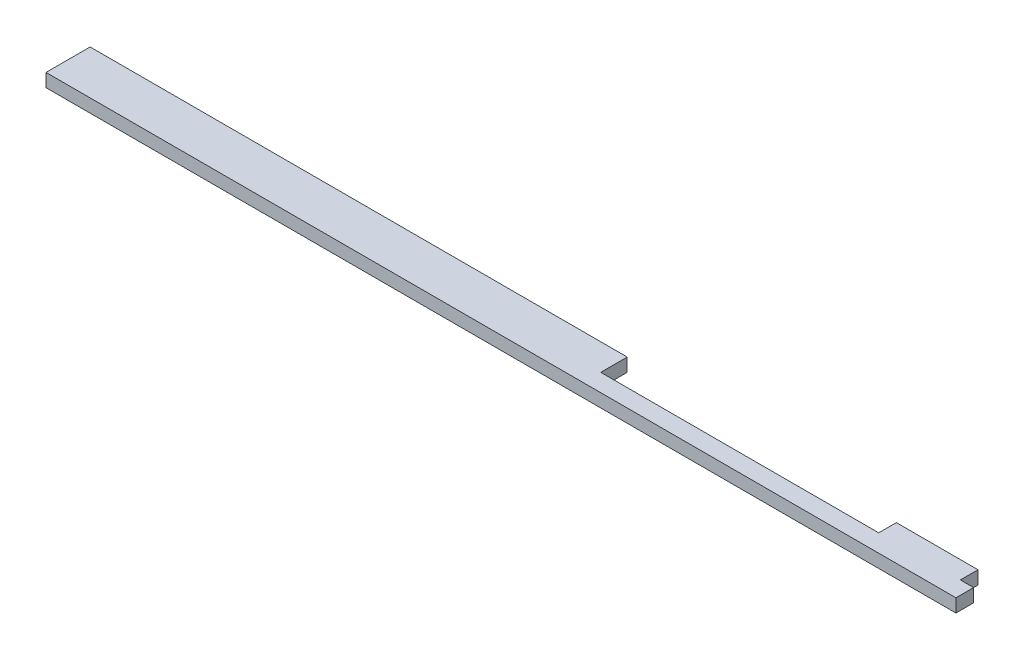
ISO-10303-21;
HEADER;
FILE_DESCRIPTION(('STEP AP214'),'2;1');
FILE_NAME('part.step','',(''),(''),'','','');
FILE_SCHEMA(('AUTOMOTIVE_DESIGN { 1 0 10303 214 1 1 1 1 }'));
ENDSEC;
DATA;
#1=APPLICATION_CONTEXT('core data for automotive mechanical design processes');
#2=APPLICATION_PROTOCOL_DEFINITION('international standard','automotive_design',2000,#1);
#3=PRODUCT_CONTEXT('',#1,'mechanical');
#4=PRODUCT('Part','Part','',(#3));
#5=PRODUCT_RELATED_PRODUCT_CATEGORY('part','',(#4));
#6=PRODUCT_DEFINITION_FORMATION('','',#4);
#7=PRODUCT_DEFINITION_CONTEXT('part definition',#1,'design');
#8=PRODUCT_DEFINITION('design','',#6,#7);
#9=PRODUCT_DEFINITION_SHAPE('','',#8);
#10=(LENGTH_UNIT() NAMED_UNIT(*) SI_UNIT(.MILLI.,.METRE.));
#11=(NAMED_UNIT(*) PLANE_ANGLE_UNIT() SI_UNIT($,.RADIAN.));
#12=(NAMED_UNIT(*) SI_UNIT($,.STERADIAN.) SOLID_ANGLE_UNIT());
#13=UNCERTAINTY_MEASURE_WITH_UNIT(LENGTH_MEASURE(1.E-05),#10,'distance_accuracy_value','');
#14=(GEOMETRIC_REPRESENTATION_CONTEXT(3) GLOBAL_UNCERTAINTY_ASSIGNED_CONTEXT((#13)) GLOBAL_UNIT_ASSIGNED_CONTEXT((#10,
#11,#12)) REPRESENTATION_CONTEXT('',''));
#15=CARTESIAN_POINT('',(0.,0.,0.));
#16=DIRECTION('',(0.,0.,1.));
#17=DIRECTION('',(1.,0.,0.));
#18=AXIS2_PLACEMENT_3D('',#15,#16,#17);
#19=CARTESIAN_POINT('',(-103.12,3.,-5.));
#20=DIRECTION('',(1.,0.,0.));
#21=DIRECTION('',(0.,0.,-1.));
#22=AXIS2_PLACEMENT_3D('',#19,#20,#21);
#23=PLANE('',#22);
#24=DIRECTION('',(0.,0.,1.));
#25=VECTOR('',#24,1.);
#26=CARTESIAN_POINT('',(-103.12,0.,-5.));
#27=LINE('',#26,#25);
#28=CARTESIAN_POINT('',(-103.12,0.,-5.));
#29=VERTEX_POINT('',#28);
#30=CARTESIAN_POINT('',(-103.12,0.,5.));
#31=VERTEX_POINT('',#30);
#32=EDGE_CURVE('E167',#29,#31,#27,.T.);
#33=ORIENTED_EDGE('',*,*,#32,.T.);
#34=DIRECTION('',(0.,-1.,0.));
#35=VECTOR('',#34,1.);
#36=CARTESIAN_POINT('',(-103.12,3.,5.));
#37=LINE('',#36,#35);
#38=CARTESIAN_POINT('',(-103.12,3.,5.));
#39=VERTEX_POINT('',#38);
#40=EDGE_CURVE('E11',#39,#31,#37,.T.);
#41=ORIENTED_EDGE('',*,*,#40,.F.);
#42=DIRECTION('',(0.,0.,1.));
#43=VECTOR('',#42,1.);
#44=CARTESIAN_POINT('',(-103.12,3.,-5.));
#45=LINE('',#44,#43);
#46=CARTESIAN_POINT('',(-103.12,3.,-5.));
#47=VERTEX_POINT('',#46);
#48=EDGE_CURVE('E178',#47,#39,#45,.T.);
#49=ORIENTED_EDGE('',*,*,#48,.F.);
#50=DIRECTION('',(0.,-1.,0.));
#51=VECTOR('',#50,1.);
#52=CARTESIAN_POINT('',(-103.12,3.,-5.));
#53=LINE('',#52,#51);
#54=EDGE_CURVE('E185',#47,#29,#53,.T.);
#55=ORIENTED_EDGE('',*,*,#54,.T.);
#56=EDGE_LOOP('',(#33,#41,#49,#55));
#57=FACE_BOUND('',#56,.T.);
#58=ADVANCED_FACE('F36',(#57),#23,.F.);
#59=CARTESIAN_POINT('',(-103.12,3.,5.));
#60=DIRECTION('',(0.,0.,-1.));
#61=DIRECTION('',(-1.,0.,0.));
#62=AXIS2_PLACEMENT_3D('',#59,#60,#61);
#63=PLANE('',#62);
#64=DIRECTION('',(1.,0.,0.));
#65=VECTOR('',#64,1.);
#66=CARTESIAN_POINT('',(-103.12,0.,5.));
#67=LINE('',#66,#65);
#68=CARTESIAN_POINT('',(103.12,0.,5.));
#69=VERTEX_POINT('',#68);
#70=EDGE_CURVE('E188',#31,#69,#67,.T.);
#71=ORIENTED_EDGE('',*,*,#70,.T.);
#72=DIRECTION('',(0.,-1.,0.));
#73=VECTOR('',#72,1.);
#74=CARTESIAN_POINT('',(103.12,3.,5.));
#75=LINE('',#74,#73);
#76=CARTESIAN_POINT('',(103.12,3.,5.));
#77=VERTEX_POINT('',#76);
#78=EDGE_CURVE('E43',#77,#69,#75,.T.);
#79=ORIENTED_EDGE('',*,*,#78,.F.);
#80=DIRECTION('',(1.,0.,0.));
#81=VECTOR('',#80,1.);
#82=CARTESIAN_POINT('',(-103.12,3.,5.));
#83=LINE('',#82,#81);
#84=EDGE_CURVE('E82',#39,#77,#83,.T.);
#85=ORIENTED_EDGE('',*,*,#84,.F.);
#86=ORIENTED_EDGE('',*,*,#40,.T.);
#87=EDGE_LOOP('',(#71,#79,#85,#86));
#88=FACE_BOUND('',#87,.T.);
#89=ADVANCED_FACE('F209',(#88),#63,.F.);
#90=CARTESIAN_POINT('',(103.12,3.,-5.));
#91=DIRECTION('',(-1.,0.,0.));
#92=DIRECTION('',(0.,0.,1.));
#93=AXIS2_PLACEMENT_3D('',#90,#91,#92);
#94=PLANE('',#93);
#95=DIRECTION('',(0.,0.,-1.));
#96=VECTOR('',#95,1.);
#97=CARTESIAN_POINT('',(103.12,0.,-5.));
#98=LINE('',#97,#96);
#99=CARTESIAN_POINT('',(103.12,0.,0.999999999999997));
#100=VERTEX_POINT('',#99);
#101=EDGE_CURVE('E190',#69,#100,#98,.T.);
#102=ORIENTED_EDGE('',*,*,#101,.T.);
#103=DIRECTION('',(0.,1.,0.));
#104=VECTOR('',#103,1.);
#105=CARTESIAN_POINT('',(103.12,0.,0.999999999999997));
#106=LINE('',#105,#104);
#107=CARTESIAN_POINT('',(103.12,3.,0.999999999999997));
#108=VERTEX_POINT('',#107);
#109=EDGE_CURVE('E168',#100,#108,#106,.T.);
#110=ORIENTED_EDGE('',*,*,#109,.T.);
#111=DIRECTION('',(0.,0.,-1.));
#112=VECTOR('',#111,1.);
#113=CARTESIAN_POINT('',(103.12,3.,-5.));
#114=LINE('',#113,#112);
#115=EDGE_CURVE('E181',#77,#108,#114,.T.);
#116=ORIENTED_EDGE('',*,*,#115,.F.);
#117=ORIENTED_EDGE('',*,*,#78,.T.);
#118=EDGE_LOOP('',(#102,#110,#116,#117));
#119=FACE_BOUND('',#118,.T.);
#120=ADVANCED_FACE('F198',(#119),#94,.F.);
#121=CARTESIAN_POINT('',(-103.12,3.,-5.));
#122=DIRECTION('',(0.,0.,1.));
#123=DIRECTION('',(1.,0.,0.));
#124=AXIS2_PLACEMENT_3D('',#121,#122,#123);
#125=PLANE('',#124);
#126=DIRECTION('',(-1.,0.,0.));
#127=VECTOR('',#126,1.);
#128=CARTESIAN_POINT('',(-103.12,3.,-5.));
#129=LINE('',#128,#127);
#130=CARTESIAN_POINT('',(18.62,3.,-5.));
#131=VERTEX_POINT('',#130);
#132=EDGE_CURVE('E59',#131,#47,#129,.T.);
#133=ORIENTED_EDGE('',*,*,#132,.F.);
#134=DIRECTION('',(0.,1.,0.));
#135=VECTOR('',#134,1.);
#136=CARTESIAN_POINT('',(18.62,0.,-5.));
#137=LINE('',#136,#135);
#138=CARTESIAN_POINT('',(18.62,0.,-5.));
#139=VERTEX_POINT('',#138);
#140=EDGE_CURVE('E165',#139,#131,#137,.T.);
#141=ORIENTED_EDGE('',*,*,#140,.F.);
#142=DIRECTION('',(-1.,0.,0.));
#143=VECTOR('',#142,1.);
#144=CARTESIAN_POINT('',(-103.12,0.,-5.));
#145=LINE('',#144,#143);
#146=EDGE_CURVE('E77',#139,#29,#145,.T.);
#147=ORIENTED_EDGE('',*,*,#146,.T.);
#148=ORIENTED_EDGE('',*,*,#54,.F.);
#149=EDGE_LOOP('',(#133,#141,#147,#148));
#150=FACE_BOUND('',#149,.T.);
#151=ADVANCED_FACE('F215',(#150),#125,.F.);
#152=CARTESIAN_POINT('',(0.,3.,0.));
#153=DIRECTION('',(0.,1.,0.));
#154=DIRECTION('',(0.,0.,1.));
#155=AXIS2_PLACEMENT_3D('',#152,#153,#154);
#156=PLANE('',#155);
#157=DIRECTION('',(0.,0.,1.));
#158=VECTOR('',#157,1.);
#159=CARTESIAN_POINT('',(18.62,3.,-5.));
#160=LINE('',#159,#158);
#161=CARTESIAN_POINT('',(18.62,3.,1.00000000000001));
#162=VERTEX_POINT('',#161);
#163=EDGE_CURVE('E126',#131,#162,#160,.T.);
#164=ORIENTED_EDGE('',*,*,#163,.F.);
#165=ORIENTED_EDGE('',*,*,#132,.T.);
#166=ORIENTED_EDGE('',*,*,#48,.T.);
#167=ORIENTED_EDGE('',*,*,#84,.T.);
#168=ORIENTED_EDGE('',*,*,#115,.T.);
#169=DIRECTION('',(1.,0.,0.));
#170=VECTOR('',#169,1.);
#171=CARTESIAN_POINT('',(103.12,3.,0.999999999999997));
#172=LINE('',#171,#170);
#173=CARTESIAN_POINT('',(100.12,3.,0.999999999999998));
#174=VERTEX_POINT('',#173);
#175=EDGE_CURVE('E140',#174,#108,#172,.T.);
#176=ORIENTED_EDGE('',*,*,#175,.F.);
#177=DIRECTION('',(0.,0.,1.));
#178=VECTOR('',#177,1.);
#179=CARTESIAN_POINT('',(100.12,3.,-3.));
#180=LINE('',#179,#178);
#181=CARTESIAN_POINT('',(100.12,3.,-3.));
#182=VERTEX_POINT('',#181);
#183=EDGE_CURVE('E142',#182,#174,#180,.T.);
#184=ORIENTED_EDGE('',*,*,#183,.F.);
#185=DIRECTION('',(1.,0.,0.));
#186=VECTOR('',#185,1.);
#187=CARTESIAN_POINT('',(100.12,3.,-3.));
#188=LINE('',#187,#186);
#189=CARTESIAN_POINT('',(81.62,3.,-3.));
#190=VERTEX_POINT('',#189);
#191=EDGE_CURVE('E160',#190,#182,#188,.T.);
#192=ORIENTED_EDGE('',*,*,#191,.F.);
#193=DIRECTION('',(0.,0.,-1.));
#194=VECTOR('',#193,1.);
#195=CARTESIAN_POINT('',(81.62,3.,-3.));
#196=LINE('',#195,#194);
#197=CARTESIAN_POINT('',(81.62,3.,1.00000000000001));
#198=VERTEX_POINT('',#197);
#199=EDGE_CURVE('E157',#198,#190,#196,.T.);
#200=ORIENTED_EDGE('',*,*,#199,.F.);
#201=DIRECTION('',(1.,0.,0.));
#202=VECTOR('',#201,1.);
#203=CARTESIAN_POINT('',(81.62,3.,1.00000000000001));
#204=LINE('',#203,#202);
#205=EDGE_CURVE('E155',#162,#198,#204,.T.);
#206=ORIENTED_EDGE('',*,*,#205,.F.);
#207=EDGE_LOOP('',(#164,#165,#166,#167,#168,#176,#184,#192,#200,#206));
#208=FACE_BOUND('',#207,.T.);
#209=ADVANCED_FACE('F204',(#208),#156,.T.);
#210=CARTESIAN_POINT('',(0.,0.,0.));
#211=DIRECTION('',(0.,1.,0.));
#212=DIRECTION('',(0.,0.,1.));
#213=AXIS2_PLACEMENT_3D('',#210,#211,#212);
#214=PLANE('',#213);
#215=ORIENTED_EDGE('',*,*,#146,.F.);
#216=DIRECTION('',(0.,0.,1.));
#217=VECTOR('',#216,1.);
#218=CARTESIAN_POINT('',(18.62,0.,-5.));
#219=LINE('',#218,#217);
#220=CARTESIAN_POINT('',(18.62,0.,1.00000000000001));
#221=VERTEX_POINT('',#220);
#222=EDGE_CURVE('E125',#139,#221,#219,.T.);
#223=ORIENTED_EDGE('',*,*,#222,.T.);
#224=DIRECTION('',(1.,0.,0.));
#225=VECTOR('',#224,1.);
#226=CARTESIAN_POINT('',(81.62,0.,1.00000000000001));
#227=LINE('',#226,#225);
#228=CARTESIAN_POINT('',(81.62,0.,1.00000000000001));
#229=VERTEX_POINT('',#228);
#230=EDGE_CURVE('E134',#221,#229,#227,.T.);
#231=ORIENTED_EDGE('',*,*,#230,.T.);
#232=DIRECTION('',(0.,0.,-1.));
#233=VECTOR('',#232,1.);
#234=CARTESIAN_POINT('',(81.62,0.,-3.));
#235=LINE('',#234,#233);
#236=CARTESIAN_POINT('',(81.62,0.,-3.));
#237=VERTEX_POINT('',#236);
#238=EDGE_CURVE('E50',#229,#237,#235,.T.);
#239=ORIENTED_EDGE('',*,*,#238,.T.);
#240=DIRECTION('',(1.,0.,0.));
#241=VECTOR('',#240,1.);
#242=CARTESIAN_POINT('',(100.12,0.,-3.));
#243=LINE('',#242,#241);
#244=CARTESIAN_POINT('',(100.12,0.,-3.));
#245=VERTEX_POINT('',#244);
#246=EDGE_CURVE('E146',#237,#245,#243,.T.);
#247=ORIENTED_EDGE('',*,*,#246,.T.);
#248=DIRECTION('',(0.,0.,1.));
#249=VECTOR('',#248,1.);
#250=CARTESIAN_POINT('',(100.12,0.,-3.));
#251=LINE('',#250,#249);
#252=CARTESIAN_POINT('',(100.12,0.,0.999999999999998));
#253=VERTEX_POINT('',#252);
#254=EDGE_CURVE('E149',#245,#253,#251,.T.);
#255=ORIENTED_EDGE('',*,*,#254,.T.);
#256=DIRECTION('',(1.,0.,0.));
#257=VECTOR('',#256,1.);
#258=CARTESIAN_POINT('',(103.12,0.,0.999999999999997));
#259=LINE('',#258,#257);
#260=EDGE_CURVE('E131',#253,#100,#259,.T.);
#261=ORIENTED_EDGE('',*,*,#260,.T.);
#262=ORIENTED_EDGE('',*,*,#101,.F.);
#263=ORIENTED_EDGE('',*,*,#70,.F.);
#264=ORIENTED_EDGE('',*,*,#32,.F.);
#265=EDGE_LOOP('',(#215,#223,#231,#239,#247,#255,#261,#262,#263,#264));
#266=FACE_BOUND('',#265,.T.);
#267=ADVANCED_FACE('F138',(#266),#214,.F.);
#268=CARTESIAN_POINT('',(18.62,0.,-5.));
#269=DIRECTION('',(-1.,0.,0.));
#270=DIRECTION('',(0.,0.,1.));
#271=AXIS2_PLACEMENT_3D('',#268,#269,#270);
#272=PLANE('',#271);
#273=ORIENTED_EDGE('',*,*,#163,.T.);
#274=DIRECTION('',(0.,1.,0.));
#275=VECTOR('',#274,1.);
#276=CARTESIAN_POINT('',(18.62,0.,1.00000000000001));
#277=LINE('',#276,#275);
#278=EDGE_CURVE('E121',#221,#162,#277,.T.);
#279=ORIENTED_EDGE('',*,*,#278,.F.);
#280=ORIENTED_EDGE('',*,*,#222,.F.);
#281=ORIENTED_EDGE('',*,*,#140,.T.);
#282=EDGE_LOOP('',(#273,#279,#280,#281));
#283=FACE_BOUND('',#282,.T.);
#284=ADVANCED_FACE('F123',(#283),#272,.F.);
#285=CARTESIAN_POINT('',(103.12,0.,0.999999999999997));
#286=DIRECTION('',(0.,0.,1.));
#287=DIRECTION('',(1.,0.,0.));
#288=AXIS2_PLACEMENT_3D('',#285,#286,#287);
#289=PLANE('',#288);
#290=ORIENTED_EDGE('',*,*,#175,.T.);
#291=ORIENTED_EDGE('',*,*,#109,.F.);
#292=ORIENTED_EDGE('',*,*,#260,.F.);
#293=DIRECTION('',(0.,1.,0.));
#294=VECTOR('',#293,1.);
#295=CARTESIAN_POINT('',(100.12,0.,0.999999999999998));
#296=LINE('',#295,#294);
#297=EDGE_CURVE('E171',#253,#174,#296,.T.);
#298=ORIENTED_EDGE('',*,*,#297,.T.);
#299=EDGE_LOOP('',(#290,#291,#292,#298));
#300=FACE_BOUND('',#299,.T.);
#301=ADVANCED_FACE('F202',(#300),#289,.F.);
#302=CARTESIAN_POINT('',(100.12,0.,-3.));
#303=DIRECTION('',(-1.,0.,0.));
#304=DIRECTION('',(0.,0.,1.));
#305=AXIS2_PLACEMENT_3D('',#302,#303,#304);
#306=PLANE('',#305);
#307=ORIENTED_EDGE('',*,*,#183,.T.);
#308=ORIENTED_EDGE('',*,*,#297,.F.);
#309=ORIENTED_EDGE('',*,*,#254,.F.);
#310=DIRECTION('',(0.,1.,0.));
#311=VECTOR('',#310,1.);
#312=CARTESIAN_POINT('',(100.12,0.,-3.));
#313=LINE('',#312,#311);
#314=EDGE_CURVE('E173',#245,#182,#313,.T.);
#315=ORIENTED_EDGE('',*,*,#314,.T.);
#316=EDGE_LOOP('',(#307,#308,#309,#315));
#317=FACE_BOUND('',#316,.T.);
#318=ADVANCED_FACE('F234',(#317),#306,.F.);
#319=CARTESIAN_POINT('',(100.12,0.,-3.));
#320=DIRECTION('',(0.,0.,1.));
#321=DIRECTION('',(1.,0.,0.));
#322=AXIS2_PLACEMENT_3D('',#319,#320,#321);
#323=PLANE('',#322);
#324=ORIENTED_EDGE('',*,*,#191,.T.);
#325=ORIENTED_EDGE('',*,*,#314,.F.);
#326=ORIENTED_EDGE('',*,*,#246,.F.);
#327=DIRECTION('',(0.,1.,0.));
#328=VECTOR('',#327,1.);
#329=CARTESIAN_POINT('',(81.62,0.,-3.));
#330=LINE('',#329,#328);
#331=EDGE_CURVE('E175',#237,#190,#330,.T.);
#332=ORIENTED_EDGE('',*,*,#331,.T.);
#333=EDGE_LOOP('',(#324,#325,#326,#332));
#334=FACE_BOUND('',#333,.T.);
#335=ADVANCED_FACE('F231',(#334),#323,.F.);
#336=CARTESIAN_POINT('',(81.62,0.,-3.));
#337=DIRECTION('',(1.,0.,0.));
#338=DIRECTION('',(0.,0.,-1.));
#339=AXIS2_PLACEMENT_3D('',#336,#337,#338);
#340=PLANE('',#339);
#341=ORIENTED_EDGE('',*,*,#199,.T.);
#342=ORIENTED_EDGE('',*,*,#331,.F.);
#343=ORIENTED_EDGE('',*,*,#238,.F.);
#344=DIRECTION('',(0.,1.,0.));
#345=VECTOR('',#344,1.);
#346=CARTESIAN_POINT('',(81.62,0.,1.00000000000001));
#347=LINE('',#346,#345);
#348=EDGE_CURVE('E130',#229,#198,#347,.T.);
#349=ORIENTED_EDGE('',*,*,#348,.T.);
#350=EDGE_LOOP('',(#341,#342,#343,#349));
#351=FACE_BOUND('',#350,.T.);
#352=ADVANCED_FACE('F228',(#351),#340,.F.);
#353=CARTESIAN_POINT('',(81.62,0.,1.00000000000001));
#354=DIRECTION('',(0.,0.,1.));
#355=DIRECTION('',(1.,0.,0.));
#356=AXIS2_PLACEMENT_3D('',#353,#354,#355);
#357=PLANE('',#356);
#358=ORIENTED_EDGE('',*,*,#205,.T.);
#359=ORIENTED_EDGE('',*,*,#348,.F.);
#360=ORIENTED_EDGE('',*,*,#230,.F.);
#361=ORIENTED_EDGE('',*,*,#278,.T.);
#362=EDGE_LOOP('',(#358,#359,#360,#361));
#363=FACE_BOUND('',#362,.T.);
#364=ADVANCED_FACE('F135',(#363),#357,.F.);
#365=CLOSED_SHELL('',(#58,#89,#120,#151,#209,#267,#284,#301,#318,#335,#352,#364));
#366=MANIFOLD_SOLID_BREP('B2',#365);
#367=ADVANCED_BREP_SHAPE_REPRESENTATION('',(#18,#366),#14);
#368=SHAPE_DEFINITION_REPRESENTATION(#9,#367);
ENDSEC;
END-ISO-10303-21;
